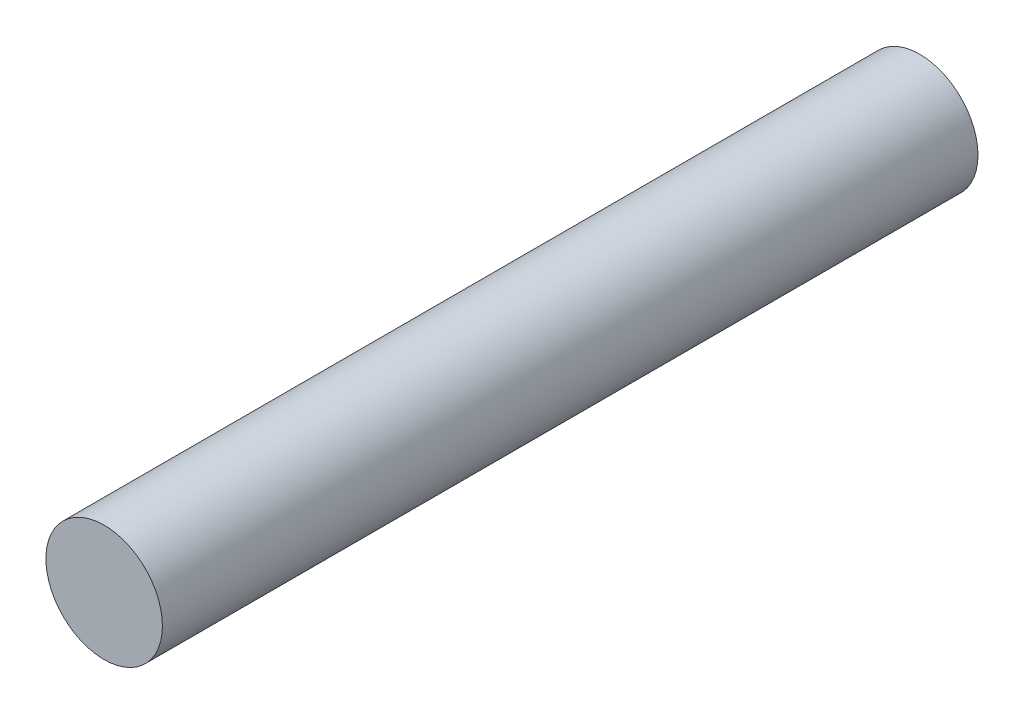
ISO-10303-21;
HEADER;
FILE_DESCRIPTION(('STEP AP214'),'2;1');
FILE_NAME('part.step','',(''),(''),'','','');
FILE_SCHEMA(('AUTOMOTIVE_DESIGN { 1 0 10303 214 1 1 1 1 }'));
ENDSEC;
DATA;
#1=APPLICATION_CONTEXT('core data for automotive mechanical design processes');
#2=APPLICATION_PROTOCOL_DEFINITION('international standard','automotive_design',2000,#1);
#3=PRODUCT_CONTEXT('',#1,'mechanical');
#4=PRODUCT('Part','Part','',(#3));
#5=PRODUCT_RELATED_PRODUCT_CATEGORY('part','',(#4));
#6=PRODUCT_DEFINITION_FORMATION('','',#4);
#7=PRODUCT_DEFINITION_CONTEXT('part definition',#1,'design');
#8=PRODUCT_DEFINITION('design','',#6,#7);
#9=PRODUCT_DEFINITION_SHAPE('','',#8);
#10=(LENGTH_UNIT() NAMED_UNIT(*) SI_UNIT(.MILLI.,.METRE.));
#11=(NAMED_UNIT(*) PLANE_ANGLE_UNIT() SI_UNIT($,.RADIAN.));
#12=(NAMED_UNIT(*) SI_UNIT($,.STERADIAN.) SOLID_ANGLE_UNIT());
#13=UNCERTAINTY_MEASURE_WITH_UNIT(LENGTH_MEASURE(1.E-05),#10,'distance_accuracy_value','');
#14=(GEOMETRIC_REPRESENTATION_CONTEXT(3) GLOBAL_UNCERTAINTY_ASSIGNED_CONTEXT((#13)) GLOBAL_UNIT_ASSIGNED_CONTEXT((#10,
#11,#12)) REPRESENTATION_CONTEXT('',''));
#15=CARTESIAN_POINT('',(0.,0.,0.));
#16=DIRECTION('',(0.,0.,1.));
#17=DIRECTION('',(1.,0.,0.));
#18=AXIS2_PLACEMENT_3D('',#15,#16,#17);
#19=CARTESIAN_POINT('',(0.,0.,35.));
#20=DIRECTION('',(0.,0.,-1.));
#21=DIRECTION('',(-1.,0.,0.));
#22=AXIS2_PLACEMENT_3D('',#19,#20,#21);
#23=CYLINDRICAL_SURFACE('',#22,2.5);
#24=CARTESIAN_POINT('',(0.,0.,35.));
#25=DIRECTION('',(0.,0.,1.));
#26=DIRECTION('',(1.,0.,0.));
#27=AXIS2_PLACEMENT_3D('',#24,#25,#26);
#28=CIRCLE('',#27,2.5);
#29=CARTESIAN_POINT('',(2.5,0.,35.));
#30=VERTEX_POINT('',#29);
#31=EDGE_CURVE('E10',#30,#30,#28,.T.);
#32=ORIENTED_EDGE('',*,*,#31,.F.);
#33=EDGE_LOOP('',(#32));
#34=FACE_BOUND('',#33,.T.);
#35=CARTESIAN_POINT('',(0.,0.,0.));
#36=DIRECTION('',(0.,0.,1.));
#37=DIRECTION('',(1.,0.,0.));
#38=AXIS2_PLACEMENT_3D('',#35,#36,#37);
#39=CIRCLE('',#38,2.5);
#40=CARTESIAN_POINT('',(2.5,0.,0.));
#41=VERTEX_POINT('',#40);
#42=EDGE_CURVE('E40',#41,#41,#39,.T.);
#43=ORIENTED_EDGE('',*,*,#42,.T.);
#44=EDGE_LOOP('',(#43));
#45=FACE_BOUND('',#44,.T.);
#46=ADVANCED_FACE('F37',(#34,#45),#23,.T.);
#47=CARTESIAN_POINT('',(0.,0.,35.));
#48=DIRECTION('',(0.,0.,1.));
#49=DIRECTION('',(1.,0.,0.));
#50=AXIS2_PLACEMENT_3D('',#47,#48,#49);
#51=PLANE('',#50);
#52=ORIENTED_EDGE('',*,*,#31,.T.);
#53=EDGE_LOOP('',(#52));
#54=FACE_BOUND('',#53,.T.);
#55=ADVANCED_FACE('F54',(#54),#51,.T.);
#56=CARTESIAN_POINT('',(0.,0.,0.));
#57=DIRECTION('',(0.,0.,1.));
#58=DIRECTION('',(1.,0.,0.));
#59=AXIS2_PLACEMENT_3D('',#56,#57,#58);
#60=PLANE('',#59);
#61=ORIENTED_EDGE('',*,*,#42,.F.);
#62=EDGE_LOOP('',(#61));
#63=FACE_BOUND('',#62,.T.);
#64=ADVANCED_FACE('F52',(#63),#60,.F.);
#65=CLOSED_SHELL('',(#46,#55,#64));
#66=MANIFOLD_SOLID_BREP('B2',#65);
#67=ADVANCED_BREP_SHAPE_REPRESENTATION('',(#18,#66),#14);
#68=SHAPE_DEFINITION_REPRESENTATION(#9,#67);
ENDSEC;
END-ISO-10303-21;
